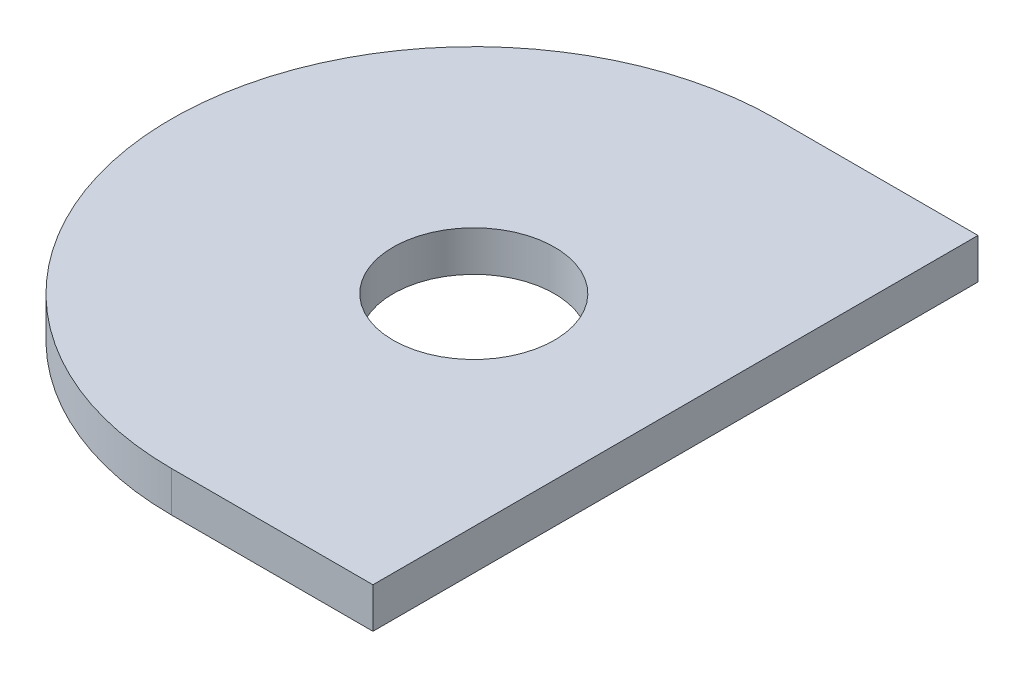
ISO-10303-21;
HEADER;
FILE_DESCRIPTION(('STEP AP214'),'2;1');
FILE_NAME('part.step','',(''),(''),'','','');
FILE_SCHEMA(('AUTOMOTIVE_DESIGN { 1 0 10303 214 1 1 1 1 }'));
ENDSEC;
DATA;
#1=APPLICATION_CONTEXT('core data for automotive mechanical design processes');
#2=APPLICATION_PROTOCOL_DEFINITION('international standard','automotive_design',2000,#1);
#3=PRODUCT_CONTEXT('',#1,'mechanical');
#4=PRODUCT('Part','Part','',(#3));
#5=PRODUCT_RELATED_PRODUCT_CATEGORY('part','',(#4));
#6=PRODUCT_DEFINITION_FORMATION('','',#4);
#7=PRODUCT_DEFINITION_CONTEXT('part definition',#1,'design');
#8=PRODUCT_DEFINITION('design','',#6,#7);
#9=PRODUCT_DEFINITION_SHAPE('','',#8);
#10=(LENGTH_UNIT() NAMED_UNIT(*) SI_UNIT(.MILLI.,.METRE.));
#11=(NAMED_UNIT(*) PLANE_ANGLE_UNIT() SI_UNIT($,.RADIAN.));
#12=(NAMED_UNIT(*) SI_UNIT($,.STERADIAN.) SOLID_ANGLE_UNIT());
#13=UNCERTAINTY_MEASURE_WITH_UNIT(LENGTH_MEASURE(1.E-05),#10,'distance_accuracy_value','');
#14=(GEOMETRIC_REPRESENTATION_CONTEXT(3) GLOBAL_UNCERTAINTY_ASSIGNED_CONTEXT((#13)) GLOBAL_UNIT_ASSIGNED_CONTEXT((#10,
#11,#12)) REPRESENTATION_CONTEXT('',''));
#15=CARTESIAN_POINT('',(0.,0.,0.));
#16=DIRECTION('',(0.,0.,1.));
#17=DIRECTION('',(1.,0.,0.));
#18=AXIS2_PLACEMENT_3D('',#15,#16,#17);
#19=CARTESIAN_POINT('',(0.,4.,-30.));
#20=DIRECTION('',(0.,1.,0.));
#21=DIRECTION('',(0.,0.,1.));
#22=AXIS2_PLACEMENT_3D('',#19,#20,#21);
#23=PLANE('',#22);
#24=CARTESIAN_POINT('',(0.,4.,-30.));
#25=DIRECTION('',(0.,1.,0.));
#26=DIRECTION('',(0.,0.,1.));
#27=AXIS2_PLACEMENT_3D('',#24,#25,#26);
#28=CIRCLE('',#27,30.);
#29=CARTESIAN_POINT('',(0.,4.,-60.));
#30=VERTEX_POINT('',#29);
#31=CARTESIAN_POINT('',(0.,4.,0.));
#32=VERTEX_POINT('',#31);
#33=EDGE_CURVE('E85',#30,#32,#28,.T.);
#34=ORIENTED_EDGE('',*,*,#33,.T.);
#35=DIRECTION('',(1.,0.,0.));
#36=VECTOR('',#35,1.);
#37=CARTESIAN_POINT('',(20.,4.,0.));
#38=LINE('',#37,#36);
#39=CARTESIAN_POINT('',(20.,4.,0.));
#40=VERTEX_POINT('',#39);
#41=EDGE_CURVE('E80',#32,#40,#38,.T.);
#42=ORIENTED_EDGE('',*,*,#41,.T.);
#43=DIRECTION('',(0.,0.,-1.));
#44=VECTOR('',#43,1.);
#45=CARTESIAN_POINT('',(20.,4.,-60.));
#46=LINE('',#45,#44);
#47=CARTESIAN_POINT('',(20.,4.,-60.));
#48=VERTEX_POINT('',#47);
#49=EDGE_CURVE('E83',#40,#48,#46,.T.);
#50=ORIENTED_EDGE('',*,*,#49,.T.);
#51=DIRECTION('',(-1.,0.,0.));
#52=VECTOR('',#51,1.);
#53=CARTESIAN_POINT('',(0.,4.,-60.));
#54=LINE('',#53,#52);
#55=EDGE_CURVE('E50',#48,#30,#54,.T.);
#56=ORIENTED_EDGE('',*,*,#55,.T.);
#57=EDGE_LOOP('',(#34,#42,#50,#56));
#58=FACE_BOUND('',#57,.T.);
#59=CARTESIAN_POINT('',(0.,4.,-30.));
#60=DIRECTION('',(0.,1.,0.));
#61=DIRECTION('',(0.,0.,1.));
#62=AXIS2_PLACEMENT_3D('',#59,#60,#61);
#63=CIRCLE('',#62,8.);
#64=CARTESIAN_POINT('',(0.,4.,-22.));
#65=VERTEX_POINT('',#64);
#66=EDGE_CURVE('E100',#65,#65,#63,.T.);
#67=ORIENTED_EDGE('',*,*,#66,.F.);
#68=EDGE_LOOP('',(#67));
#69=FACE_BOUND('',#68,.T.);
#70=ADVANCED_FACE('F33',(#58,#69),#23,.T.);
#71=CARTESIAN_POINT('',(0.,0.,-30.));
#72=DIRECTION('',(0.,1.,0.));
#73=DIRECTION('',(0.,0.,1.));
#74=AXIS2_PLACEMENT_3D('',#71,#72,#73);
#75=PLANE('',#74);
#76=CARTESIAN_POINT('',(0.,0.,-30.));
#77=DIRECTION('',(0.,1.,0.));
#78=DIRECTION('',(0.,0.,1.));
#79=AXIS2_PLACEMENT_3D('',#76,#77,#78);
#80=CIRCLE('',#79,30.);
#81=CARTESIAN_POINT('',(0.,0.,-60.));
#82=VERTEX_POINT('',#81);
#83=CARTESIAN_POINT('',(0.,0.,0.));
#84=VERTEX_POINT('',#83);
#85=EDGE_CURVE('E97',#82,#84,#80,.T.);
#86=ORIENTED_EDGE('',*,*,#85,.F.);
#87=DIRECTION('',(-1.,0.,0.));
#88=VECTOR('',#87,1.);
#89=CARTESIAN_POINT('',(0.,0.,-60.));
#90=LINE('',#89,#88);
#91=CARTESIAN_POINT('',(20.,0.,-60.));
#92=VERTEX_POINT('',#91);
#93=EDGE_CURVE('E73',#92,#82,#90,.T.);
#94=ORIENTED_EDGE('',*,*,#93,.F.);
#95=DIRECTION('',(0.,0.,-1.));
#96=VECTOR('',#95,1.);
#97=CARTESIAN_POINT('',(20.,0.,-60.));
#98=LINE('',#97,#96);
#99=CARTESIAN_POINT('',(20.,0.,0.));
#100=VERTEX_POINT('',#99);
#101=EDGE_CURVE('E67',#100,#92,#98,.T.);
#102=ORIENTED_EDGE('',*,*,#101,.F.);
#103=DIRECTION('',(1.,0.,0.));
#104=VECTOR('',#103,1.);
#105=CARTESIAN_POINT('',(20.,0.,0.));
#106=LINE('',#105,#104);
#107=EDGE_CURVE('E89',#84,#100,#106,.T.);
#108=ORIENTED_EDGE('',*,*,#107,.F.);
#109=EDGE_LOOP('',(#86,#94,#102,#108));
#110=FACE_BOUND('',#109,.T.);
#111=CARTESIAN_POINT('',(0.,0.,-30.));
#112=DIRECTION('',(0.,1.,0.));
#113=DIRECTION('',(0.,0.,1.));
#114=AXIS2_PLACEMENT_3D('',#111,#112,#113);
#115=CIRCLE('',#114,8.);
#116=CARTESIAN_POINT('',(0.,0.,-22.));
#117=VERTEX_POINT('',#116);
#118=EDGE_CURVE('E112',#117,#117,#115,.T.);
#119=ORIENTED_EDGE('',*,*,#118,.T.);
#120=EDGE_LOOP('',(#119));
#121=FACE_BOUND('',#120,.T.);
#122=ADVANCED_FACE('F108',(#110,#121),#75,.F.);
#123=CARTESIAN_POINT('',(0.,4.,-30.));
#124=DIRECTION('',(0.,-1.,0.));
#125=DIRECTION('',(0.,0.,-1.));
#126=AXIS2_PLACEMENT_3D('',#123,#124,#125);
#127=CYLINDRICAL_SURFACE('',#126,30.);
#128=ORIENTED_EDGE('',*,*,#85,.T.);
#129=DIRECTION('',(0.,-1.,0.));
#130=VECTOR('',#129,1.);
#131=CARTESIAN_POINT('',(0.,4.,0.));
#132=LINE('',#131,#130);
#133=EDGE_CURVE('E11',#32,#84,#132,.T.);
#134=ORIENTED_EDGE('',*,*,#133,.F.);
#135=ORIENTED_EDGE('',*,*,#33,.F.);
#136=DIRECTION('',(0.,-1.,0.));
#137=VECTOR('',#136,1.);
#138=CARTESIAN_POINT('',(0.,4.,-60.));
#139=LINE('',#138,#137);
#140=EDGE_CURVE('E93',#30,#82,#139,.T.);
#141=ORIENTED_EDGE('',*,*,#140,.T.);
#142=EDGE_LOOP('',(#128,#134,#135,#141));
#143=FACE_BOUND('',#142,.T.);
#144=ADVANCED_FACE('F35',(#143),#127,.T.);
#145=CARTESIAN_POINT('',(20.,4.,0.));
#146=DIRECTION('',(0.,0.,-1.));
#147=DIRECTION('',(-1.,0.,0.));
#148=AXIS2_PLACEMENT_3D('',#145,#146,#147);
#149=PLANE('',#148);
#150=ORIENTED_EDGE('',*,*,#107,.T.);
#151=DIRECTION('',(0.,-1.,0.));
#152=VECTOR('',#151,1.);
#153=CARTESIAN_POINT('',(20.,4.,0.));
#154=LINE('',#153,#152);
#155=EDGE_CURVE('E42',#40,#100,#154,.T.);
#156=ORIENTED_EDGE('',*,*,#155,.F.);
#157=ORIENTED_EDGE('',*,*,#41,.F.);
#158=ORIENTED_EDGE('',*,*,#133,.T.);
#159=EDGE_LOOP('',(#150,#156,#157,#158));
#160=FACE_BOUND('',#159,.T.);
#161=ADVANCED_FACE('F88',(#160),#149,.F.);
#162=CARTESIAN_POINT('',(20.,4.,-60.));
#163=DIRECTION('',(-1.,0.,0.));
#164=DIRECTION('',(0.,0.,1.));
#165=AXIS2_PLACEMENT_3D('',#162,#163,#164);
#166=PLANE('',#165);
#167=ORIENTED_EDGE('',*,*,#101,.T.);
#168=DIRECTION('',(0.,-1.,0.));
#169=VECTOR('',#168,1.);
#170=CARTESIAN_POINT('',(20.,4.,-60.));
#171=LINE('',#170,#169);
#172=EDGE_CURVE('E90',#48,#92,#171,.T.);
#173=ORIENTED_EDGE('',*,*,#172,.F.);
#174=ORIENTED_EDGE('',*,*,#49,.F.);
#175=ORIENTED_EDGE('',*,*,#155,.T.);
#176=EDGE_LOOP('',(#167,#173,#174,#175));
#177=FACE_BOUND('',#176,.T.);
#178=ADVANCED_FACE('F91',(#177),#166,.F.);
#179=CARTESIAN_POINT('',(0.,4.,-60.));
#180=DIRECTION('',(0.,0.,1.));
#181=DIRECTION('',(1.,0.,0.));
#182=AXIS2_PLACEMENT_3D('',#179,#180,#181);
#183=PLANE('',#182);
#184=ORIENTED_EDGE('',*,*,#93,.T.);
#185=ORIENTED_EDGE('',*,*,#140,.F.);
#186=ORIENTED_EDGE('',*,*,#55,.F.);
#187=ORIENTED_EDGE('',*,*,#172,.T.);
#188=EDGE_LOOP('',(#184,#185,#186,#187));
#189=FACE_BOUND('',#188,.T.);
#190=ADVANCED_FACE('F105',(#189),#183,.F.);
#191=CARTESIAN_POINT('',(0.,4.,-30.));
#192=DIRECTION('',(0.,-1.,0.));
#193=DIRECTION('',(0.,0.,-1.));
#194=AXIS2_PLACEMENT_3D('',#191,#192,#193);
#195=CYLINDRICAL_SURFACE('',#194,8.);
#196=ORIENTED_EDGE('',*,*,#66,.T.);
#197=EDGE_LOOP('',(#196));
#198=FACE_BOUND('',#197,.T.);
#199=ORIENTED_EDGE('',*,*,#118,.F.);
#200=EDGE_LOOP('',(#199));
#201=FACE_BOUND('',#200,.T.);
#202=ADVANCED_FACE('F118',(#198,#201),#195,.F.);
#203=CLOSED_SHELL('',(#70,#122,#144,#161,#178,#190,#202));
#204=MANIFOLD_SOLID_BREP('B2',#203);
#205=ADVANCED_BREP_SHAPE_REPRESENTATION('',(#18,#204),#14);
#206=SHAPE_DEFINITION_REPRESENTATION(#9,#205);
ENDSEC;
END-ISO-10303-21;
